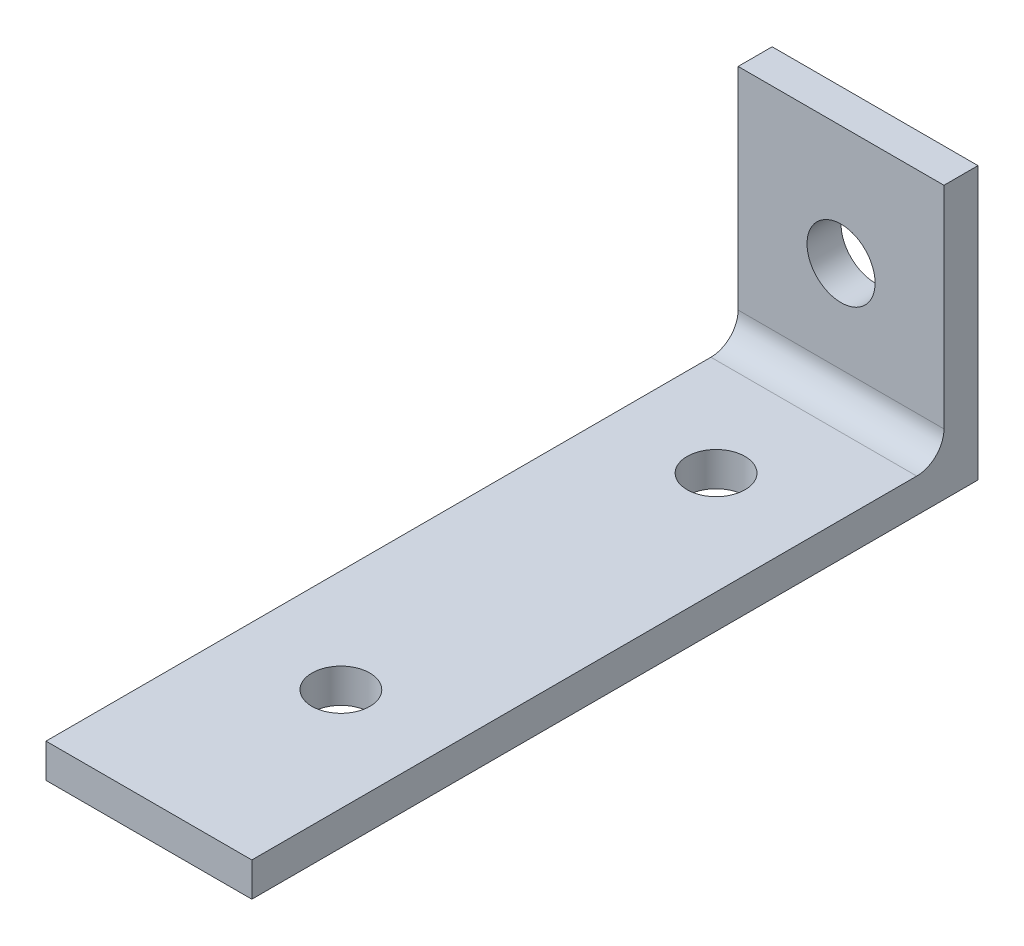
ISO-10303-21;
HEADER;
FILE_DESCRIPTION(('STEP AP214'),'2;1');
FILE_NAME('part.step','',(''),(''),'','','');
FILE_SCHEMA(('AUTOMOTIVE_DESIGN { 1 0 10303 214 1 1 1 1 }'));
ENDSEC;
DATA;
#1=APPLICATION_CONTEXT('core data for automotive mechanical design processes');
#2=APPLICATION_PROTOCOL_DEFINITION('international standard','automotive_design',2000,#1);
#3=PRODUCT_CONTEXT('',#1,'mechanical');
#4=PRODUCT('Part','Part','',(#3));
#5=PRODUCT_RELATED_PRODUCT_CATEGORY('part','',(#4));
#6=PRODUCT_DEFINITION_FORMATION('','',#4);
#7=PRODUCT_DEFINITION_CONTEXT('part definition',#1,'design');
#8=PRODUCT_DEFINITION('design','',#6,#7);
#9=PRODUCT_DEFINITION_SHAPE('','',#8);
#10=(LENGTH_UNIT() NAMED_UNIT(*) SI_UNIT(.MILLI.,.METRE.));
#11=(NAMED_UNIT(*) PLANE_ANGLE_UNIT() SI_UNIT($,.RADIAN.));
#12=(NAMED_UNIT(*) SI_UNIT($,.STERADIAN.) SOLID_ANGLE_UNIT());
#13=UNCERTAINTY_MEASURE_WITH_UNIT(LENGTH_MEASURE(1.E-05),#10,'distance_accuracy_value','');
#14=(GEOMETRIC_REPRESENTATION_CONTEXT(3) GLOBAL_UNCERTAINTY_ASSIGNED_CONTEXT((#13)) GLOBAL_UNIT_ASSIGNED_CONTEXT((#10,
#11,#12)) REPRESENTATION_CONTEXT('',''));
#15=CARTESIAN_POINT('',(0.,0.,0.));
#16=DIRECTION('',(0.,0.,1.));
#17=DIRECTION('',(1.,0.,0.));
#18=AXIS2_PLACEMENT_3D('',#15,#16,#17);
#19=CARTESIAN_POINT('',(19.2024,12.7,-22.225));
#20=DIRECTION('',(0.,0.,-1.));
#21=DIRECTION('',(0.,1.,0.));
#22=AXIS2_PLACEMENT_3D('',#19,#20,#21);
#23=PLANE('',#22);
#24=CARTESIAN_POINT('',(9.6012,1.5875,-22.225));
#25=DIRECTION('',(0.,0.,1.));
#26=DIRECTION('',(1.,0.,0.));
#27=AXIS2_PLACEMENT_3D('',#24,#25,#26);
#28=CIRCLE('',#27,3.175);
#29=CARTESIAN_POINT('',(12.7762,1.5875,-22.225));
#30=VERTEX_POINT('',#29);
#31=EDGE_CURVE('E138',#30,#30,#28,.T.);
#32=ORIENTED_EDGE('',*,*,#31,.F.);
#33=EDGE_LOOP('',(#32));
#34=FACE_BOUND('',#33,.T.);
#35=DIRECTION('',(0.,-1.,0.));
#36=VECTOR('',#35,1.);
#37=CARTESIAN_POINT('',(0.,12.7,-22.225));
#38=LINE('',#37,#36);
#39=CARTESIAN_POINT('',(0.,12.7,-22.225));
#40=VERTEX_POINT('',#39);
#41=CARTESIAN_POINT('',(0.,-6.985,-22.225));
#42=VERTEX_POINT('',#41);
#43=EDGE_CURVE('E110',#40,#42,#38,.T.);
#44=ORIENTED_EDGE('',*,*,#43,.T.);
#45=DIRECTION('',(-1.,0.,0.));
#46=VECTOR('',#45,1.);
#47=CARTESIAN_POINT('',(19.2024,-6.985,-22.225));
#48=LINE('',#47,#46);
#49=CARTESIAN_POINT('',(19.2024,-6.985,-22.225));
#50=VERTEX_POINT('',#49);
#51=EDGE_CURVE('E32',#42,#50,#48,.F.);
#52=ORIENTED_EDGE('',*,*,#51,.T.);
#53=DIRECTION('',(0.,-1.,0.));
#54=VECTOR('',#53,1.);
#55=CARTESIAN_POINT('',(19.2024,12.7,-22.225));
#56=LINE('',#55,#54);
#57=CARTESIAN_POINT('',(19.2024,12.7,-22.225));
#58=VERTEX_POINT('',#57);
#59=EDGE_CURVE('E85',#58,#50,#56,.T.);
#60=ORIENTED_EDGE('',*,*,#59,.F.);
#61=DIRECTION('',(-1.,0.,0.));
#62=VECTOR('',#61,1.);
#63=CARTESIAN_POINT('',(19.2024,12.7,-22.225));
#64=LINE('',#63,#62);
#65=EDGE_CURVE('E109',#58,#40,#64,.T.);
#66=ORIENTED_EDGE('',*,*,#65,.T.);
#67=EDGE_LOOP('',(#44,#52,#60,#66));
#68=FACE_BOUND('',#67,.T.);
#69=ADVANCED_FACE('F17',(#34,#68),#23,.F.);
#70=CARTESIAN_POINT('',(19.2024,-9.525,25.4));
#71=DIRECTION('',(0.,-1.,0.));
#72=DIRECTION('',(0.,0.,-1.));
#73=AXIS2_PLACEMENT_3D('',#70,#71,#72);
#74=PLANE('',#73);
#75=CARTESIAN_POINT('',(9.6012,-9.525,-10.5664));
#76=DIRECTION('',(0.,1.,0.));
#77=DIRECTION('',(0.,0.,1.));
#78=AXIS2_PLACEMENT_3D('',#75,#76,#77);
#79=CIRCLE('',#78,2.7);
#80=CARTESIAN_POINT('',(9.6012,-9.525,-7.8664));
#81=VERTEX_POINT('',#80);
#82=EDGE_CURVE('E135',#81,#81,#79,.T.);
#83=ORIENTED_EDGE('',*,*,#82,.F.);
#84=EDGE_LOOP('',(#83));
#85=FACE_BOUND('',#84,.T.);
#86=CARTESIAN_POINT('',(9.6012,-9.525,24.4336));
#87=DIRECTION('',(0.,1.,0.));
#88=DIRECTION('',(0.,0.,1.));
#89=AXIS2_PLACEMENT_3D('',#86,#87,#88);
#90=CIRCLE('',#89,2.7);
#91=CARTESIAN_POINT('',(9.6012,-9.525,27.1336));
#92=VERTEX_POINT('',#91);
#93=EDGE_CURVE('E160',#92,#92,#90,.T.);
#94=ORIENTED_EDGE('',*,*,#93,.F.);
#95=EDGE_LOOP('',(#94));
#96=FACE_BOUND('',#95,.T.);
#97=DIRECTION('',(0.,0.,1.));
#98=VECTOR('',#97,1.);
#99=CARTESIAN_POINT('',(19.2024,-9.525,-22.225));
#100=LINE('',#99,#98);
#101=CARTESIAN_POINT('',(19.2024,-9.525,-19.685));
#102=VERTEX_POINT('',#101);
#103=CARTESIAN_POINT('',(19.2024,-9.525,42.3418));
#104=VERTEX_POINT('',#103);
#105=EDGE_CURVE('E75',#102,#104,#100,.T.);
#106=ORIENTED_EDGE('',*,*,#105,.F.);
#107=DIRECTION('',(-1.,0.,0.));
#108=VECTOR('',#107,1.);
#109=CARTESIAN_POINT('',(0.,-9.525,-19.685));
#110=LINE('',#109,#108);
#111=CARTESIAN_POINT('',(0.,-9.525,-19.685));
#112=VERTEX_POINT('',#111);
#113=EDGE_CURVE('E94',#102,#112,#110,.T.);
#114=ORIENTED_EDGE('',*,*,#113,.T.);
#115=DIRECTION('',(0.,0.,1.));
#116=VECTOR('',#115,1.);
#117=CARTESIAN_POINT('',(0.,-9.525,25.4));
#118=LINE('',#117,#116);
#119=CARTESIAN_POINT('',(0.,-9.525,42.3418));
#120=VERTEX_POINT('',#119);
#121=EDGE_CURVE('E90',#112,#120,#118,.T.);
#122=ORIENTED_EDGE('',*,*,#121,.T.);
#123=DIRECTION('',(-1.,0.,0.));
#124=VECTOR('',#123,1.);
#125=CARTESIAN_POINT('',(19.2024,-9.525,42.3418));
#126=LINE('',#125,#124);
#127=EDGE_CURVE('E88',#104,#120,#126,.T.);
#128=ORIENTED_EDGE('',*,*,#127,.F.);
#129=EDGE_LOOP('',(#106,#114,#122,#128));
#130=FACE_BOUND('',#129,.T.);
#131=ADVANCED_FACE('F89',(#85,#96,#130),#74,.F.);
#132=CARTESIAN_POINT('',(19.2024,-9.525,42.3418));
#133=DIRECTION('',(0.,0.,-1.));
#134=DIRECTION('',(-1.,0.,0.));
#135=AXIS2_PLACEMENT_3D('',#132,#133,#134);
#136=PLANE('',#135);
#137=DIRECTION('',(0.,-1.,0.));
#138=VECTOR('',#137,1.);
#139=CARTESIAN_POINT('',(0.,-9.525,42.3418));
#140=LINE('',#139,#138);
#141=CARTESIAN_POINT('',(0.,-12.7,42.3418));
#142=VERTEX_POINT('',#141);
#143=EDGE_CURVE('E114',#120,#142,#140,.T.);
#144=ORIENTED_EDGE('',*,*,#143,.T.);
#145=DIRECTION('',(-1.,0.,0.));
#146=VECTOR('',#145,1.);
#147=CARTESIAN_POINT('',(19.2024,-12.7,42.3418));
#148=LINE('',#147,#146);
#149=CARTESIAN_POINT('',(19.2024,-12.7,42.3418));
#150=VERTEX_POINT('',#149);
#151=EDGE_CURVE('E95',#150,#142,#148,.T.);
#152=ORIENTED_EDGE('',*,*,#151,.F.);
#153=DIRECTION('',(0.,-1.,0.));
#154=VECTOR('',#153,1.);
#155=CARTESIAN_POINT('',(19.2024,-9.525,42.3418));
#156=LINE('',#155,#154);
#157=EDGE_CURVE('E79',#104,#150,#156,.T.);
#158=ORIENTED_EDGE('',*,*,#157,.F.);
#159=ORIENTED_EDGE('',*,*,#127,.T.);
#160=EDGE_LOOP('',(#144,#152,#158,#159));
#161=FACE_BOUND('',#160,.T.);
#162=ADVANCED_FACE('F97',(#161),#136,.F.);
#163=CARTESIAN_POINT('',(19.2024,-12.7,-25.4));
#164=DIRECTION('',(0.,1.,0.));
#165=DIRECTION('',(0.,0.,1.));
#166=AXIS2_PLACEMENT_3D('',#163,#164,#165);
#167=PLANE('',#166);
#168=CARTESIAN_POINT('',(9.6012,-12.7,-10.5664));
#169=DIRECTION('',(0.,1.,0.));
#170=DIRECTION('',(0.,0.,1.));
#171=AXIS2_PLACEMENT_3D('',#168,#169,#170);
#172=CIRCLE('',#171,2.7);
#173=CARTESIAN_POINT('',(9.6012,-12.7,-7.8664));
#174=VERTEX_POINT('',#173);
#175=EDGE_CURVE('E134',#174,#174,#172,.T.);
#176=ORIENTED_EDGE('',*,*,#175,.T.);
#177=EDGE_LOOP('',(#176));
#178=FACE_BOUND('',#177,.T.);
#179=CARTESIAN_POINT('',(9.6012,-12.7,24.4336));
#180=DIRECTION('',(0.,1.,0.));
#181=DIRECTION('',(0.,0.,1.));
#182=AXIS2_PLACEMENT_3D('',#179,#180,#181);
#183=CIRCLE('',#182,2.7);
#184=CARTESIAN_POINT('',(9.6012,-12.7,27.1336));
#185=VERTEX_POINT('',#184);
#186=EDGE_CURVE('E131',#185,#185,#183,.T.);
#187=ORIENTED_EDGE('',*,*,#186,.T.);
#188=EDGE_LOOP('',(#187));
#189=FACE_BOUND('',#188,.T.);
#190=DIRECTION('',(0.,0.,-1.));
#191=VECTOR('',#190,1.);
#192=CARTESIAN_POINT('',(0.,-12.7,-25.4));
#193=LINE('',#192,#191);
#194=CARTESIAN_POINT('',(0.,-12.7,-25.4));
#195=VERTEX_POINT('',#194);
#196=EDGE_CURVE('E116',#142,#195,#193,.T.);
#197=ORIENTED_EDGE('',*,*,#196,.T.);
#198=DIRECTION('',(-1.,0.,0.));
#199=VECTOR('',#198,1.);
#200=CARTESIAN_POINT('',(19.2024,-12.7,-25.4));
#201=LINE('',#200,#199);
#202=CARTESIAN_POINT('',(19.2024,-12.7,-25.4));
#203=VERTEX_POINT('',#202);
#204=EDGE_CURVE('E127',#203,#195,#201,.T.);
#205=ORIENTED_EDGE('',*,*,#204,.F.);
#206=DIRECTION('',(0.,0.,-1.));
#207=VECTOR('',#206,1.);
#208=CARTESIAN_POINT('',(19.2024,-12.7,25.4));
#209=LINE('',#208,#207);
#210=EDGE_CURVE('E100',#150,#203,#209,.T.);
#211=ORIENTED_EDGE('',*,*,#210,.F.);
#212=ORIENTED_EDGE('',*,*,#151,.T.);
#213=EDGE_LOOP('',(#197,#205,#211,#212));
#214=FACE_BOUND('',#213,.T.);
#215=ADVANCED_FACE('F144',(#178,#189,#214),#167,.F.);
#216=CARTESIAN_POINT('',(19.2024,12.7,-25.4));
#217=DIRECTION('',(0.,0.,1.));
#218=DIRECTION('',(1.,0.,0.));
#219=AXIS2_PLACEMENT_3D('',#216,#217,#218);
#220=PLANE('',#219);
#221=CARTESIAN_POINT('',(9.6012,1.5875,-25.4));
#222=DIRECTION('',(0.,0.,1.));
#223=DIRECTION('',(1.,0.,0.));
#224=AXIS2_PLACEMENT_3D('',#221,#222,#223);
#225=CIRCLE('',#224,3.175);
#226=CARTESIAN_POINT('',(12.7762,1.5875,-25.4));
#227=VERTEX_POINT('',#226);
#228=EDGE_CURVE('E112',#227,#227,#225,.T.);
#229=ORIENTED_EDGE('',*,*,#228,.T.);
#230=EDGE_LOOP('',(#229));
#231=FACE_BOUND('',#230,.T.);
#232=DIRECTION('',(0.,1.,0.));
#233=VECTOR('',#232,1.);
#234=CARTESIAN_POINT('',(0.,12.7,-25.4));
#235=LINE('',#234,#233);
#236=CARTESIAN_POINT('',(0.,12.7,-25.4));
#237=VERTEX_POINT('',#236);
#238=EDGE_CURVE('E118',#195,#237,#235,.T.);
#239=ORIENTED_EDGE('',*,*,#238,.T.);
#240=DIRECTION('',(-1.,0.,0.));
#241=VECTOR('',#240,1.);
#242=CARTESIAN_POINT('',(19.2024,12.7,-25.4));
#243=LINE('',#242,#241);
#244=CARTESIAN_POINT('',(19.2024,12.7,-25.4));
#245=VERTEX_POINT('',#244);
#246=EDGE_CURVE('E124',#245,#237,#243,.T.);
#247=ORIENTED_EDGE('',*,*,#246,.F.);
#248=DIRECTION('',(0.,1.,0.));
#249=VECTOR('',#248,1.);
#250=CARTESIAN_POINT('',(19.2024,12.7,-25.4));
#251=LINE('',#250,#249);
#252=EDGE_CURVE('E102',#203,#245,#251,.T.);
#253=ORIENTED_EDGE('',*,*,#252,.F.);
#254=ORIENTED_EDGE('',*,*,#204,.T.);
#255=EDGE_LOOP('',(#239,#247,#253,#254));
#256=FACE_BOUND('',#255,.T.);
#257=ADVANCED_FACE('F151',(#231,#256),#220,.F.);
#258=CARTESIAN_POINT('',(19.2024,12.7,-22.225));
#259=DIRECTION('',(0.,-1.,0.));
#260=DIRECTION('',(0.,0.,-1.));
#261=AXIS2_PLACEMENT_3D('',#258,#259,#260);
#262=PLANE('',#261);
#263=DIRECTION('',(0.,0.,1.));
#264=VECTOR('',#263,1.);
#265=CARTESIAN_POINT('',(0.,12.7,-22.225));
#266=LINE('',#265,#264);
#267=EDGE_CURVE('E120',#237,#40,#266,.T.);
#268=ORIENTED_EDGE('',*,*,#267,.T.);
#269=ORIENTED_EDGE('',*,*,#65,.F.);
#270=DIRECTION('',(0.,0.,1.));
#271=VECTOR('',#270,1.);
#272=CARTESIAN_POINT('',(19.2024,12.7,-22.225));
#273=LINE('',#272,#271);
#274=EDGE_CURVE('E107',#245,#58,#273,.T.);
#275=ORIENTED_EDGE('',*,*,#274,.F.);
#276=ORIENTED_EDGE('',*,*,#246,.T.);
#277=EDGE_LOOP('',(#268,#269,#275,#276));
#278=FACE_BOUND('',#277,.T.);
#279=ADVANCED_FACE('F154',(#278),#262,.F.);
#280=CARTESIAN_POINT('',(19.2024,0.,0.));
#281=DIRECTION('',(-1.,0.,0.));
#282=DIRECTION('',(0.,0.,1.));
#283=AXIS2_PLACEMENT_3D('',#280,#281,#282);
#284=PLANE('',#283);
#285=ORIENTED_EDGE('',*,*,#59,.T.);
#286=CARTESIAN_POINT('',(19.2024,-6.985,-19.685));
#287=DIRECTION('',(-1.,0.,0.));
#288=DIRECTION('',(0.,0.,1.));
#289=AXIS2_PLACEMENT_3D('',#286,#287,#288);
#290=CIRCLE('',#289,2.54);
#291=EDGE_CURVE('E11',#50,#102,#290,.T.);
#292=ORIENTED_EDGE('',*,*,#291,.T.);
#293=ORIENTED_EDGE('',*,*,#105,.T.);
#294=ORIENTED_EDGE('',*,*,#157,.T.);
#295=ORIENTED_EDGE('',*,*,#210,.T.);
#296=ORIENTED_EDGE('',*,*,#252,.T.);
#297=ORIENTED_EDGE('',*,*,#274,.T.);
#298=EDGE_LOOP('',(#285,#292,#293,#294,#295,#296,#297));
#299=FACE_BOUND('',#298,.T.);
#300=ADVANCED_FACE('F77',(#299),#284,.F.);
#301=CARTESIAN_POINT('',(0.,0.,0.));
#302=DIRECTION('',(-1.,0.,0.));
#303=DIRECTION('',(0.,0.,1.));
#304=AXIS2_PLACEMENT_3D('',#301,#302,#303);
#305=PLANE('',#304);
#306=ORIENTED_EDGE('',*,*,#43,.F.);
#307=ORIENTED_EDGE('',*,*,#267,.F.);
#308=ORIENTED_EDGE('',*,*,#238,.F.);
#309=ORIENTED_EDGE('',*,*,#196,.F.);
#310=ORIENTED_EDGE('',*,*,#143,.F.);
#311=ORIENTED_EDGE('',*,*,#121,.F.);
#312=CARTESIAN_POINT('',(0.,-6.985,-19.685));
#313=DIRECTION('',(-1.,0.,0.));
#314=DIRECTION('',(0.,0.,1.));
#315=AXIS2_PLACEMENT_3D('',#312,#313,#314);
#316=CIRCLE('',#315,2.54);
#317=EDGE_CURVE('E25',#112,#42,#316,.F.);
#318=ORIENTED_EDGE('',*,*,#317,.T.);
#319=EDGE_LOOP('',(#306,#307,#308,#309,#310,#311,#318));
#320=FACE_BOUND('',#319,.T.);
#321=ADVANCED_FACE('F141',(#320),#305,.T.);
#322=CARTESIAN_POINT('',(9.6012,1.5875,-25.4));
#323=DIRECTION('',(0.,0.,1.));
#324=DIRECTION('',(1.,0.,0.));
#325=AXIS2_PLACEMENT_3D('',#322,#323,#324);
#326=CYLINDRICAL_SURFACE('',#325,3.175);
#327=ORIENTED_EDGE('',*,*,#228,.F.);
#328=EDGE_LOOP('',(#327));
#329=FACE_BOUND('',#328,.T.);
#330=ORIENTED_EDGE('',*,*,#31,.T.);
#331=EDGE_LOOP('',(#330));
#332=FACE_BOUND('',#331,.T.);
#333=ADVANCED_FACE('F177',(#329,#332),#326,.F.);
#334=CARTESIAN_POINT('',(9.6012,-47.625,24.4336));
#335=DIRECTION('',(0.,1.,0.));
#336=DIRECTION('',(0.,0.,1.));
#337=AXIS2_PLACEMENT_3D('',#334,#335,#336);
#338=CYLINDRICAL_SURFACE('',#337,2.7);
#339=ORIENTED_EDGE('',*,*,#93,.T.);
#340=EDGE_LOOP('',(#339));
#341=FACE_BOUND('',#340,.T.);
#342=ORIENTED_EDGE('',*,*,#186,.F.);
#343=EDGE_LOOP('',(#342));
#344=FACE_BOUND('',#343,.T.);
#345=ADVANCED_FACE('F174',(#341,#344),#338,.F.);
#346=CARTESIAN_POINT('',(9.6012,-47.625,-10.5664));
#347=DIRECTION('',(0.,1.,0.));
#348=DIRECTION('',(0.,0.,1.));
#349=AXIS2_PLACEMENT_3D('',#346,#347,#348);
#350=CYLINDRICAL_SURFACE('',#349,2.7);
#351=ORIENTED_EDGE('',*,*,#82,.T.);
#352=EDGE_LOOP('',(#351));
#353=FACE_BOUND('',#352,.T.);
#354=ORIENTED_EDGE('',*,*,#175,.F.);
#355=EDGE_LOOP('',(#354));
#356=FACE_BOUND('',#355,.T.);
#357=ADVANCED_FACE('F166',(#353,#356),#350,.F.);
#358=CARTESIAN_POINT('',(19.2024,-6.985,-19.685));
#359=DIRECTION('',(1.,0.,0.));
#360=DIRECTION('',(0.,0.,-1.));
#361=AXIS2_PLACEMENT_3D('',#358,#359,#360);
#362=CYLINDRICAL_SURFACE('',#361,2.54);
#363=ORIENTED_EDGE('',*,*,#291,.F.);
#364=ORIENTED_EDGE('',*,*,#51,.F.);
#365=ORIENTED_EDGE('',*,*,#317,.F.);
#366=ORIENTED_EDGE('',*,*,#113,.F.);
#367=EDGE_LOOP('',(#363,#364,#365,#366));
#368=FACE_BOUND('',#367,.T.);
#369=ADVANCED_FACE('F19',(#368),#362,.F.);
#370=CLOSED_SHELL('',(#69,#131,#162,#215,#257,#279,#300,#321,#333,#345,#357,#369));
#371=MANIFOLD_SOLID_BREP('B1',#370);
#372=ADVANCED_BREP_SHAPE_REPRESENTATION('',(#18,#371),#14);
#373=SHAPE_DEFINITION_REPRESENTATION(#9,#372);
ENDSEC;
END-ISO-10303-21;
